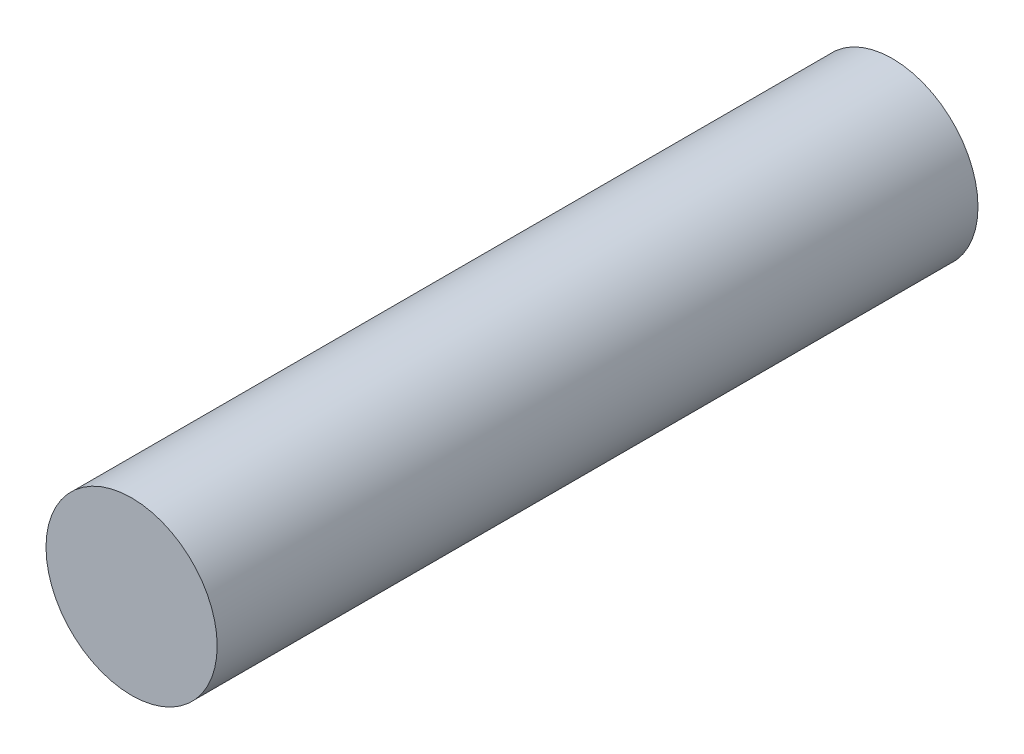
ISO-10303-21;
HEADER;
FILE_DESCRIPTION(('STEP AP214'),'2;1');
FILE_NAME('part.step','',(''),(''),'','','');
FILE_SCHEMA(('AUTOMOTIVE_DESIGN { 1 0 10303 214 1 1 1 1 }'));
ENDSEC;
DATA;
#1=APPLICATION_CONTEXT('core data for automotive mechanical design processes');
#2=APPLICATION_PROTOCOL_DEFINITION('international standard','automotive_design',2000,#1);
#3=PRODUCT_CONTEXT('',#1,'mechanical');
#4=PRODUCT('Part','Part','',(#3));
#5=PRODUCT_RELATED_PRODUCT_CATEGORY('part','',(#4));
#6=PRODUCT_DEFINITION_FORMATION('','',#4);
#7=PRODUCT_DEFINITION_CONTEXT('part definition',#1,'design');
#8=PRODUCT_DEFINITION('design','',#6,#7);
#9=PRODUCT_DEFINITION_SHAPE('','',#8);
#10=(LENGTH_UNIT() NAMED_UNIT(*) SI_UNIT(.MILLI.,.METRE.));
#11=(NAMED_UNIT(*) PLANE_ANGLE_UNIT() SI_UNIT($,.RADIAN.));
#12=(NAMED_UNIT(*) SI_UNIT($,.STERADIAN.) SOLID_ANGLE_UNIT());
#13=UNCERTAINTY_MEASURE_WITH_UNIT(LENGTH_MEASURE(1.E-05),#10,'distance_accuracy_value','');
#14=(GEOMETRIC_REPRESENTATION_CONTEXT(3) GLOBAL_UNCERTAINTY_ASSIGNED_CONTEXT((#13)) GLOBAL_UNIT_ASSIGNED_CONTEXT((#10,
#11,#12)) REPRESENTATION_CONTEXT('',''));
#15=CARTESIAN_POINT('',(0.,0.,0.));
#16=DIRECTION('',(0.,0.,1.));
#17=DIRECTION('',(1.,0.,0.));
#18=AXIS2_PLACEMENT_3D('',#15,#16,#17);
#19=CARTESIAN_POINT('',(0.,0.,20.));
#20=DIRECTION('',(0.,0.,-1.));
#21=DIRECTION('',(-1.,0.,0.));
#22=AXIS2_PLACEMENT_3D('',#19,#20,#21);
#23=CYLINDRICAL_SURFACE('',#22,2.25);
#24=CARTESIAN_POINT('',(0.,0.,20.));
#25=DIRECTION('',(0.,0.,1.));
#26=DIRECTION('',(1.,0.,0.));
#27=AXIS2_PLACEMENT_3D('',#24,#25,#26);
#28=CIRCLE('',#27,2.25);
#29=CARTESIAN_POINT('',(2.25,0.,20.));
#30=VERTEX_POINT('',#29);
#31=EDGE_CURVE('E10',#30,#30,#28,.T.);
#32=ORIENTED_EDGE('',*,*,#31,.F.);
#33=EDGE_LOOP('',(#32));
#34=FACE_BOUND('',#33,.T.);
#35=CARTESIAN_POINT('',(0.,0.,0.));
#36=DIRECTION('',(0.,0.,1.));
#37=DIRECTION('',(1.,0.,0.));
#38=AXIS2_PLACEMENT_3D('',#35,#36,#37);
#39=CIRCLE('',#38,2.25);
#40=CARTESIAN_POINT('',(2.25,0.,0.));
#41=VERTEX_POINT('',#40);
#42=EDGE_CURVE('E40',#41,#41,#39,.T.);
#43=ORIENTED_EDGE('',*,*,#42,.T.);
#44=EDGE_LOOP('',(#43));
#45=FACE_BOUND('',#44,.T.);
#46=ADVANCED_FACE('F37',(#34,#45),#23,.T.);
#47=CARTESIAN_POINT('',(0.,0.,20.));
#48=DIRECTION('',(0.,0.,1.));
#49=DIRECTION('',(1.,0.,0.));
#50=AXIS2_PLACEMENT_3D('',#47,#48,#49);
#51=PLANE('',#50);
#52=ORIENTED_EDGE('',*,*,#31,.T.);
#53=EDGE_LOOP('',(#52));
#54=FACE_BOUND('',#53,.T.);
#55=ADVANCED_FACE('F54',(#54),#51,.T.);
#56=CARTESIAN_POINT('',(0.,0.,0.));
#57=DIRECTION('',(0.,0.,1.));
#58=DIRECTION('',(1.,0.,0.));
#59=AXIS2_PLACEMENT_3D('',#56,#57,#58);
#60=PLANE('',#59);
#61=ORIENTED_EDGE('',*,*,#42,.F.);
#62=EDGE_LOOP('',(#61));
#63=FACE_BOUND('',#62,.T.);
#64=ADVANCED_FACE('F52',(#63),#60,.F.);
#65=CLOSED_SHELL('',(#46,#55,#64));
#66=MANIFOLD_SOLID_BREP('B2',#65);
#67=ADVANCED_BREP_SHAPE_REPRESENTATION('',(#18,#66),#14);
#68=SHAPE_DEFINITION_REPRESENTATION(#9,#67);
ENDSEC;
END-ISO-10303-21;
